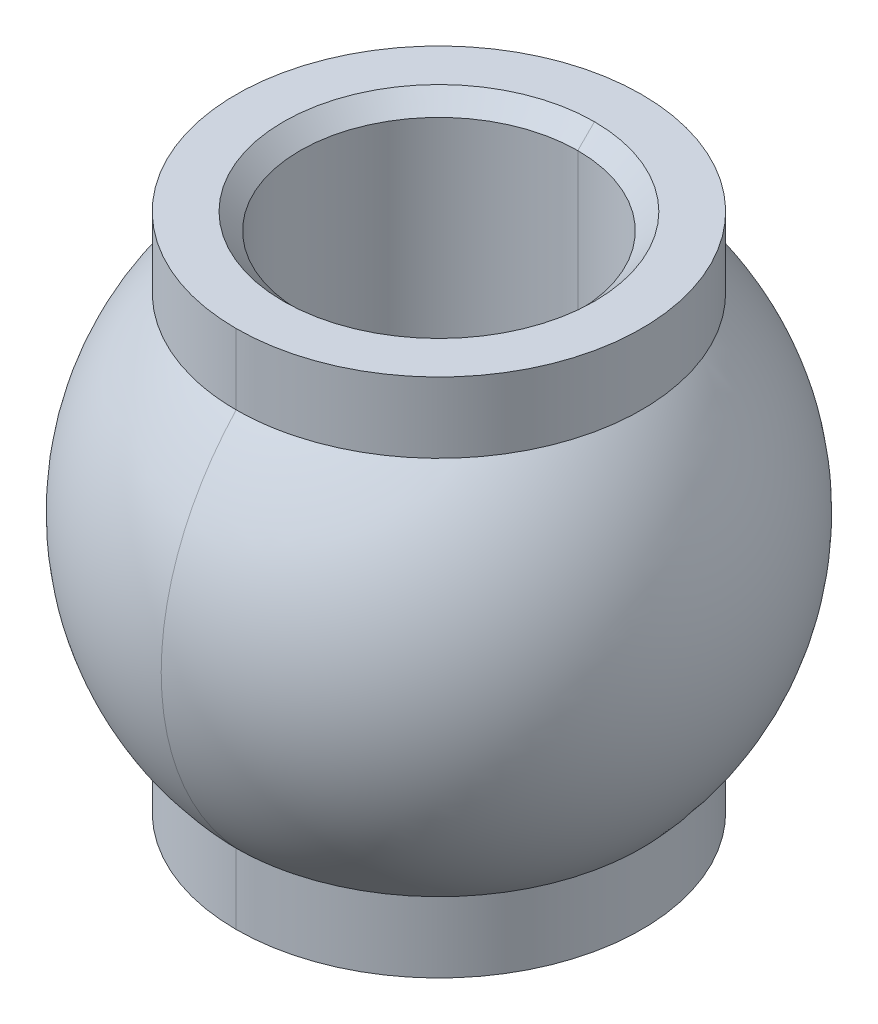
ISO-10303-21;
HEADER;
FILE_DESCRIPTION(('STEP AP214'),'2;1');
FILE_NAME('part.step','',(''),(''),'','','');
FILE_SCHEMA(('AUTOMOTIVE_DESIGN { 1 0 10303 214 1 1 1 1 }'));
ENDSEC;
DATA;
#1=APPLICATION_CONTEXT('core data for automotive mechanical design processes');
#2=APPLICATION_PROTOCOL_DEFINITION('international standard','automotive_design',2000,#1);
#3=PRODUCT_CONTEXT('',#1,'mechanical');
#4=PRODUCT('Part','Part','',(#3));
#5=PRODUCT_RELATED_PRODUCT_CATEGORY('part','',(#4));
#6=PRODUCT_DEFINITION_FORMATION('','',#4);
#7=PRODUCT_DEFINITION_CONTEXT('part definition',#1,'design');
#8=PRODUCT_DEFINITION('design','',#6,#7);
#9=PRODUCT_DEFINITION_SHAPE('','',#8);
#10=(LENGTH_UNIT() NAMED_UNIT(*) SI_UNIT(.MILLI.,.METRE.));
#11=(NAMED_UNIT(*) PLANE_ANGLE_UNIT() SI_UNIT($,.RADIAN.));
#12=(NAMED_UNIT(*) SI_UNIT($,.STERADIAN.) SOLID_ANGLE_UNIT());
#13=UNCERTAINTY_MEASURE_WITH_UNIT(LENGTH_MEASURE(1.E-05),#10,'distance_accuracy_value','');
#14=(GEOMETRIC_REPRESENTATION_CONTEXT(3) GLOBAL_UNCERTAINTY_ASSIGNED_CONTEXT((#13)) GLOBAL_UNIT_ASSIGNED_CONTEXT((#10,
#11,#12)) REPRESENTATION_CONTEXT('',''));
#15=CARTESIAN_POINT('',(0.,0.,0.));
#16=DIRECTION('',(0.,0.,1.));
#17=DIRECTION('',(1.,0.,0.));
#18=AXIS2_PLACEMENT_3D('',#15,#16,#17);
#19=CARTESIAN_POINT('',(0.,0.,0.));
#20=DIRECTION('',(0.,0.,1.));
#21=DIRECTION('',(1.,0.,0.));
#22=AXIS2_PLACEMENT_3D('',#19,#20,#21);
#23=SPHERICAL_SURFACE('',#22,12.7);
#24=CARTESIAN_POINT('',(0.,0.,0.));
#25=DIRECTION('',(1.,0.,0.));
#26=DIRECTION('',(0.,0.,1.));
#27=AXIS2_PLACEMENT_3D('',#24,#25,#26);
#28=CIRCLE('',#27,12.7);
#29=CARTESIAN_POINT('',(0.,-8.67977874141962,-9.271));
#30=VERTEX_POINT('',#29);
#31=CARTESIAN_POINT('',(0.,0.,-12.7));
#32=VERTEX_POINT('',#31);
#33=EDGE_CURVE('E107',#30,#32,#28,.T.);
#34=ORIENTED_EDGE('',*,*,#33,.T.);
#35=CARTESIAN_POINT('',(0.,0.,0.));
#36=DIRECTION('',(1.,0.,0.));
#37=DIRECTION('',(0.,0.,1.));
#38=AXIS2_PLACEMENT_3D('',#35,#36,#37);
#39=CIRCLE('',#38,12.7);
#40=CARTESIAN_POINT('',(0.,8.67977874141962,-9.271));
#41=VERTEX_POINT('',#40);
#42=EDGE_CURVE('E11',#32,#41,#39,.T.);
#43=ORIENTED_EDGE('',*,*,#42,.T.);
#44=CARTESIAN_POINT('',(0.,8.67977874141962,0.));
#45=DIRECTION('',(0.,-1.,0.));
#46=DIRECTION('',(0.,0.,-1.));
#47=AXIS2_PLACEMENT_3D('',#44,#45,#46);
#48=CIRCLE('',#47,9.271);
#49=CARTESIAN_POINT('',(0.,8.67977874141962,9.271));
#50=VERTEX_POINT('',#49);
#51=EDGE_CURVE('E104',#41,#50,#48,.T.);
#52=ORIENTED_EDGE('',*,*,#51,.T.);
#53=CARTESIAN_POINT('',(0.,0.,0.));
#54=DIRECTION('',(1.,0.,0.));
#55=DIRECTION('',(0.,0.,1.));
#56=AXIS2_PLACEMENT_3D('',#53,#54,#55);
#57=CIRCLE('',#56,12.7);
#58=CARTESIAN_POINT('',(0.,0.,12.7));
#59=VERTEX_POINT('',#58);
#60=EDGE_CURVE('E28',#50,#59,#57,.T.);
#61=ORIENTED_EDGE('',*,*,#60,.T.);
#62=CARTESIAN_POINT('',(0.,0.,0.));
#63=DIRECTION('',(1.,0.,0.));
#64=DIRECTION('',(0.,0.,1.));
#65=AXIS2_PLACEMENT_3D('',#62,#63,#64);
#66=CIRCLE('',#65,12.7);
#67=CARTESIAN_POINT('',(0.,-8.67977874141962,9.271));
#68=VERTEX_POINT('',#67);
#69=EDGE_CURVE('E171',#59,#68,#66,.T.);
#70=ORIENTED_EDGE('',*,*,#69,.T.);
#71=CARTESIAN_POINT('',(0.,-8.67977874141962,0.));
#72=DIRECTION('',(0.,1.,0.));
#73=DIRECTION('',(0.,0.,-1.));
#74=AXIS2_PLACEMENT_3D('',#71,#72,#73);
#75=CIRCLE('',#74,9.271);
#76=EDGE_CURVE('E119',#68,#30,#75,.T.);
#77=ORIENTED_EDGE('',*,*,#76,.T.);
#78=EDGE_LOOP('',(#34,#43,#52,#61,#70,#77));
#79=FACE_BOUND('',#78,.T.);
#80=ADVANCED_FACE('F17',(#79),#23,.T.);
#81=CARTESIAN_POINT('',(0.,0.,0.));
#82=DIRECTION('',(0.,0.,1.));
#83=DIRECTION('',(1.,0.,0.));
#84=AXIS2_PLACEMENT_3D('',#81,#82,#83);
#85=SPHERICAL_SURFACE('',#84,12.7);
#86=ORIENTED_EDGE('',*,*,#33,.F.);
#87=CARTESIAN_POINT('',(0.,-8.67977874141962,0.));
#88=DIRECTION('',(0.,1.,0.));
#89=DIRECTION('',(0.,0.,-1.));
#90=AXIS2_PLACEMENT_3D('',#87,#88,#89);
#91=CIRCLE('',#90,9.271);
#92=EDGE_CURVE('E156',#30,#68,#91,.T.);
#93=ORIENTED_EDGE('',*,*,#92,.T.);
#94=ORIENTED_EDGE('',*,*,#69,.F.);
#95=ORIENTED_EDGE('',*,*,#60,.F.);
#96=CARTESIAN_POINT('',(0.,8.67977874141962,0.));
#97=DIRECTION('',(0.,-1.,0.));
#98=DIRECTION('',(0.,0.,-1.));
#99=AXIS2_PLACEMENT_3D('',#96,#97,#98);
#100=CIRCLE('',#99,9.271);
#101=EDGE_CURVE('E121',#50,#41,#100,.T.);
#102=ORIENTED_EDGE('',*,*,#101,.T.);
#103=ORIENTED_EDGE('',*,*,#42,.F.);
#104=EDGE_LOOP('',(#86,#93,#94,#95,#102,#103));
#105=FACE_BOUND('',#104,.T.);
#106=ADVANCED_FACE('F122',(#105),#85,.T.);
#107=CARTESIAN_POINT('',(0.,0.,0.));
#108=DIRECTION('',(0.,1.,0.));
#109=DIRECTION('',(0.,0.,-1.));
#110=AXIS2_PLACEMENT_3D('',#107,#108,#109);
#111=CYLINDRICAL_SURFACE('',#110,9.271);
#112=DIRECTION('',(0.,1.,0.));
#113=VECTOR('',#112,1.);
#114=CARTESIAN_POINT('',(0.,0.,-9.271));
#115=LINE('',#114,#113);
#116=CARTESIAN_POINT('',(0.,11.8999,-9.271));
#117=VERTEX_POINT('',#116);
#118=EDGE_CURVE('E114',#41,#117,#115,.T.);
#119=ORIENTED_EDGE('',*,*,#118,.T.);
#120=CARTESIAN_POINT('',(0.,11.8999,0.));
#121=DIRECTION('',(0.,1.,0.));
#122=DIRECTION('',(0.,0.,-1.));
#123=AXIS2_PLACEMENT_3D('',#120,#121,#122);
#124=CIRCLE('',#123,9.271);
#125=CARTESIAN_POINT('',(0.,11.8999,9.271));
#126=VERTEX_POINT('',#125);
#127=EDGE_CURVE('E131',#126,#117,#124,.T.);
#128=ORIENTED_EDGE('',*,*,#127,.F.);
#129=DIRECTION('',(0.,-1.,0.));
#130=VECTOR('',#129,1.);
#131=CARTESIAN_POINT('',(0.,0.,9.271));
#132=LINE('',#131,#130);
#133=EDGE_CURVE('E116',#126,#50,#132,.T.);
#134=ORIENTED_EDGE('',*,*,#133,.T.);
#135=ORIENTED_EDGE('',*,*,#51,.F.);
#136=EDGE_LOOP('',(#119,#128,#134,#135));
#137=FACE_BOUND('',#136,.T.);
#138=ADVANCED_FACE('F111',(#137),#111,.T.);
#139=CARTESIAN_POINT('',(0.,0.,0.));
#140=DIRECTION('',(0.,1.,0.));
#141=DIRECTION('',(0.,0.,-1.));
#142=AXIS2_PLACEMENT_3D('',#139,#140,#141);
#143=CYLINDRICAL_SURFACE('',#142,9.271);
#144=DIRECTION('',(0.,1.,0.));
#145=VECTOR('',#144,1.);
#146=CARTESIAN_POINT('',(0.,0.,-9.271));
#147=LINE('',#146,#145);
#148=CARTESIAN_POINT('',(0.,-11.8999,-9.271));
#149=VERTEX_POINT('',#148);
#150=EDGE_CURVE('E145',#149,#30,#147,.T.);
#151=ORIENTED_EDGE('',*,*,#150,.T.);
#152=ORIENTED_EDGE('',*,*,#76,.F.);
#153=DIRECTION('',(0.,-1.,0.));
#154=VECTOR('',#153,1.);
#155=CARTESIAN_POINT('',(0.,0.,9.271));
#156=LINE('',#155,#154);
#157=CARTESIAN_POINT('',(0.,-11.8999,9.271));
#158=VERTEX_POINT('',#157);
#159=EDGE_CURVE('E148',#68,#158,#156,.T.);
#160=ORIENTED_EDGE('',*,*,#159,.T.);
#161=CARTESIAN_POINT('',(0.,-11.8999,0.));
#162=DIRECTION('',(0.,-1.,0.));
#163=DIRECTION('',(0.,0.,-1.));
#164=AXIS2_PLACEMENT_3D('',#161,#162,#163);
#165=CIRCLE('',#164,9.271);
#166=EDGE_CURVE('E144',#149,#158,#165,.T.);
#167=ORIENTED_EDGE('',*,*,#166,.F.);
#168=EDGE_LOOP('',(#151,#152,#160,#167));
#169=FACE_BOUND('',#168,.T.);
#170=ADVANCED_FACE('F437',(#169),#143,.T.);
#171=CARTESIAN_POINT('',(0.,0.,0.));
#172=DIRECTION('',(0.,1.,0.));
#173=DIRECTION('',(0.,0.,-1.));
#174=AXIS2_PLACEMENT_3D('',#171,#172,#173);
#175=CYLINDRICAL_SURFACE('',#174,9.271);
#176=ORIENTED_EDGE('',*,*,#150,.F.);
#177=CARTESIAN_POINT('',(0.,-11.8999,0.));
#178=DIRECTION('',(0.,-1.,0.));
#179=DIRECTION('',(0.,0.,-1.));
#180=AXIS2_PLACEMENT_3D('',#177,#178,#179);
#181=CIRCLE('',#180,9.271);
#182=EDGE_CURVE('E142',#158,#149,#181,.T.);
#183=ORIENTED_EDGE('',*,*,#182,.F.);
#184=ORIENTED_EDGE('',*,*,#159,.F.);
#185=ORIENTED_EDGE('',*,*,#92,.F.);
#186=EDGE_LOOP('',(#176,#183,#184,#185));
#187=FACE_BOUND('',#186,.T.);
#188=ADVANCED_FACE('F426',(#187),#175,.T.);
#189=CARTESIAN_POINT('',(0.,0.,0.));
#190=DIRECTION('',(0.,1.,0.));
#191=DIRECTION('',(0.,0.,-1.));
#192=AXIS2_PLACEMENT_3D('',#189,#190,#191);
#193=CYLINDRICAL_SURFACE('',#192,9.271);
#194=ORIENTED_EDGE('',*,*,#118,.F.);
#195=ORIENTED_EDGE('',*,*,#101,.F.);
#196=ORIENTED_EDGE('',*,*,#133,.F.);
#197=CARTESIAN_POINT('',(0.,11.8999,0.));
#198=DIRECTION('',(0.,1.,0.));
#199=DIRECTION('',(0.,0.,-1.));
#200=AXIS2_PLACEMENT_3D('',#197,#198,#199);
#201=CIRCLE('',#200,9.271);
#202=EDGE_CURVE('E129',#117,#126,#201,.T.);
#203=ORIENTED_EDGE('',*,*,#202,.F.);
#204=EDGE_LOOP('',(#194,#195,#196,#203));
#205=FACE_BOUND('',#204,.T.);
#206=ADVANCED_FACE('F127',(#205),#193,.T.);
#207=CARTESIAN_POINT('',(0.,11.8999,0.));
#208=DIRECTION('',(0.,1.,0.));
#209=DIRECTION('',(1.,0.,0.));
#210=AXIS2_PLACEMENT_3D('',#207,#208,#209);
#211=PLANE('',#210);
#212=ORIENTED_EDGE('',*,*,#202,.T.);
#213=ORIENTED_EDGE('',*,*,#127,.T.);
#214=EDGE_LOOP('',(#212,#213));
#215=FACE_BOUND('',#214,.T.);
#216=CARTESIAN_POINT('',(0.,11.8999,0.));
#217=DIRECTION('',(0.,-1.,0.));
#218=DIRECTION('',(0.,0.,-1.));
#219=AXIS2_PLACEMENT_3D('',#216,#217,#218);
#220=CIRCLE('',#219,7.112);
#221=CARTESIAN_POINT('',(0.,11.8999,-7.112));
#222=VERTEX_POINT('',#221);
#223=CARTESIAN_POINT('',(0.,11.8999,7.112));
#224=VERTEX_POINT('',#223);
#225=EDGE_CURVE('E165',#222,#224,#220,.T.);
#226=ORIENTED_EDGE('',*,*,#225,.T.);
#227=CARTESIAN_POINT('',(0.,11.8999,0.));
#228=DIRECTION('',(0.,-1.,0.));
#229=DIRECTION('',(0.,0.,-1.));
#230=AXIS2_PLACEMENT_3D('',#227,#228,#229);
#231=CIRCLE('',#230,7.112);
#232=EDGE_CURVE('E188',#224,#222,#231,.T.);
#233=ORIENTED_EDGE('',*,*,#232,.T.);
#234=EDGE_LOOP('',(#226,#233));
#235=FACE_BOUND('',#234,.T.);
#236=ADVANCED_FACE('F409',(#215,#235),#211,.T.);
#237=CARTESIAN_POINT('',(0.,-11.8999,0.));
#238=DIRECTION('',(0.,-1.,0.));
#239=DIRECTION('',(0.,0.,-1.));
#240=AXIS2_PLACEMENT_3D('',#237,#238,#239);
#241=PLANE('',#240);
#242=ORIENTED_EDGE('',*,*,#166,.T.);
#243=ORIENTED_EDGE('',*,*,#182,.T.);
#244=EDGE_LOOP('',(#242,#243));
#245=FACE_BOUND('',#244,.T.);
#246=CARTESIAN_POINT('',(0.,-11.8999,0.));
#247=DIRECTION('',(0.,1.,0.));
#248=DIRECTION('',(0.,0.,-1.));
#249=AXIS2_PLACEMENT_3D('',#246,#247,#248);
#250=CIRCLE('',#249,7.112);
#251=CARTESIAN_POINT('',(0.,-11.8999,-7.112));
#252=VERTEX_POINT('',#251);
#253=CARTESIAN_POINT('',(0.,-11.8999,7.112));
#254=VERTEX_POINT('',#253);
#255=EDGE_CURVE('E169',#252,#254,#250,.T.);
#256=ORIENTED_EDGE('',*,*,#255,.T.);
#257=CARTESIAN_POINT('',(0.,-11.8999,0.));
#258=DIRECTION('',(0.,1.,0.));
#259=DIRECTION('',(0.,0.,-1.));
#260=AXIS2_PLACEMENT_3D('',#257,#258,#259);
#261=CIRCLE('',#260,7.112);
#262=EDGE_CURVE('E170',#254,#252,#261,.T.);
#263=ORIENTED_EDGE('',*,*,#262,.T.);
#264=EDGE_LOOP('',(#256,#263));
#265=FACE_BOUND('',#264,.T.);
#266=ADVANCED_FACE('F401',(#245,#265),#241,.T.);
#267=CARTESIAN_POINT('',(0.,11.5189,0.));
#268=DIRECTION('',(0.,1.,0.));
#269=DIRECTION('',(0.,0.,-1.));
#270=AXIS2_PLACEMENT_3D('',#267,#268,#269);
#271=CONICAL_SURFACE('',#270,6.731,0.785398163397449);
#272=DIRECTION('',(0.,0.707106781186547,-0.707106781186548));
#273=VECTOR('',#272,1.);
#274=CARTESIAN_POINT('',(0.,11.5189,-6.731));
#275=LINE('',#274,#273);
#276=CARTESIAN_POINT('',(0.,11.1379,-6.35));
#277=VERTEX_POINT('',#276);
#278=EDGE_CURVE('E179',#277,#222,#275,.T.);
#279=ORIENTED_EDGE('',*,*,#278,.F.);
#280=CARTESIAN_POINT('',(0.,11.1379,0.));
#281=DIRECTION('',(0.,1.,0.));
#282=DIRECTION('',(0.,0.,-1.));
#283=AXIS2_PLACEMENT_3D('',#280,#281,#282);
#284=CIRCLE('',#283,6.35);
#285=CARTESIAN_POINT('',(0.,11.1379,6.35));
#286=VERTEX_POINT('',#285);
#287=EDGE_CURVE('E209',#286,#277,#284,.T.);
#288=ORIENTED_EDGE('',*,*,#287,.F.);
#289=DIRECTION('',(0.,-0.707106781186547,-0.707106781186548));
#290=VECTOR('',#289,1.);
#291=CARTESIAN_POINT('',(0.,11.5189,6.731));
#292=LINE('',#291,#290);
#293=EDGE_CURVE('E21',#224,#286,#292,.T.);
#294=ORIENTED_EDGE('',*,*,#293,.F.);
#295=ORIENTED_EDGE('',*,*,#225,.F.);
#296=EDGE_LOOP('',(#279,#288,#294,#295));
#297=FACE_BOUND('',#296,.T.);
#298=ADVANCED_FACE('F239',(#297),#271,.F.);
#299=CARTESIAN_POINT('',(0.,11.5189,0.));
#300=DIRECTION('',(0.,1.,0.));
#301=DIRECTION('',(0.,0.,-1.));
#302=AXIS2_PLACEMENT_3D('',#299,#300,#301);
#303=CONICAL_SURFACE('',#302,6.731,0.785398163397449);
#304=ORIENTED_EDGE('',*,*,#278,.T.);
#305=ORIENTED_EDGE('',*,*,#232,.F.);
#306=ORIENTED_EDGE('',*,*,#293,.T.);
#307=CARTESIAN_POINT('',(0.,11.1379,0.));
#308=DIRECTION('',(0.,1.,0.));
#309=DIRECTION('',(0.,0.,-1.));
#310=AXIS2_PLACEMENT_3D('',#307,#308,#309);
#311=CIRCLE('',#310,6.35);
#312=EDGE_CURVE('E196',#277,#286,#311,.T.);
#313=ORIENTED_EDGE('',*,*,#312,.F.);
#314=EDGE_LOOP('',(#304,#305,#306,#313));
#315=FACE_BOUND('',#314,.T.);
#316=ADVANCED_FACE('F234',(#315),#303,.F.);
#317=CARTESIAN_POINT('',(0.,-11.5189,0.));
#318=DIRECTION('',(0.,-1.,0.));
#319=DIRECTION('',(0.,0.,-1.));
#320=AXIS2_PLACEMENT_3D('',#317,#318,#319);
#321=CONICAL_SURFACE('',#320,6.731,0.785398163397449);
#322=DIRECTION('',(0.,-0.707106781186547,-0.707106781186548));
#323=VECTOR('',#322,1.);
#324=CARTESIAN_POINT('',(0.,-11.5189,-6.731));
#325=LINE('',#324,#323);
#326=CARTESIAN_POINT('',(0.,-11.1379,-6.35));
#327=VERTEX_POINT('',#326);
#328=EDGE_CURVE('E177',#327,#252,#325,.T.);
#329=ORIENTED_EDGE('',*,*,#328,.F.);
#330=CARTESIAN_POINT('',(0.,-11.1379,0.));
#331=DIRECTION('',(0.,-1.,0.));
#332=DIRECTION('',(0.,0.,-1.));
#333=AXIS2_PLACEMENT_3D('',#330,#331,#332);
#334=CIRCLE('',#333,6.35);
#335=CARTESIAN_POINT('',(0.,-11.1379,6.35));
#336=VERTEX_POINT('',#335);
#337=EDGE_CURVE('E197',#336,#327,#334,.T.);
#338=ORIENTED_EDGE('',*,*,#337,.F.);
#339=DIRECTION('',(0.,0.707106781186547,-0.707106781186548));
#340=VECTOR('',#339,1.);
#341=CARTESIAN_POINT('',(0.,-11.5189,6.731));
#342=LINE('',#341,#340);
#343=EDGE_CURVE('E166',#254,#336,#342,.T.);
#344=ORIENTED_EDGE('',*,*,#343,.F.);
#345=ORIENTED_EDGE('',*,*,#255,.F.);
#346=EDGE_LOOP('',(#329,#338,#344,#345));
#347=FACE_BOUND('',#346,.T.);
#348=ADVANCED_FACE('F248',(#347),#321,.F.);
#349=CARTESIAN_POINT('',(0.,-11.5189,0.));
#350=DIRECTION('',(0.,-1.,0.));
#351=DIRECTION('',(0.,0.,-1.));
#352=AXIS2_PLACEMENT_3D('',#349,#350,#351);
#353=CONICAL_SURFACE('',#352,6.731,0.785398163397449);
#354=ORIENTED_EDGE('',*,*,#328,.T.);
#355=ORIENTED_EDGE('',*,*,#262,.F.);
#356=ORIENTED_EDGE('',*,*,#343,.T.);
#357=CARTESIAN_POINT('',(0.,-11.1379,0.));
#358=DIRECTION('',(0.,-1.,0.));
#359=DIRECTION('',(0.,0.,-1.));
#360=AXIS2_PLACEMENT_3D('',#357,#358,#359);
#361=CIRCLE('',#360,6.35);
#362=EDGE_CURVE('E201',#327,#336,#361,.T.);
#363=ORIENTED_EDGE('',*,*,#362,.F.);
#364=EDGE_LOOP('',(#354,#355,#356,#363));
#365=FACE_BOUND('',#364,.T.);
#366=ADVANCED_FACE('F19',(#365),#353,.F.);
#367=CARTESIAN_POINT('',(0.,0.,0.));
#368=DIRECTION('',(0.,1.,0.));
#369=DIRECTION('',(0.,0.,-1.));
#370=AXIS2_PLACEMENT_3D('',#367,#368,#369);
#371=CYLINDRICAL_SURFACE('',#370,6.35);
#372=DIRECTION('',(0.,-1.,0.));
#373=VECTOR('',#372,1.);
#374=CARTESIAN_POINT('',(0.,0.,-6.35));
#375=LINE('',#374,#373);
#376=EDGE_CURVE('E192',#277,#327,#375,.T.);
#377=ORIENTED_EDGE('',*,*,#376,.T.);
#378=ORIENTED_EDGE('',*,*,#362,.T.);
#379=DIRECTION('',(0.,1.,0.));
#380=VECTOR('',#379,1.);
#381=CARTESIAN_POINT('',(0.,0.,6.35));
#382=LINE('',#381,#380);
#383=EDGE_CURVE('E202',#336,#286,#382,.T.);
#384=ORIENTED_EDGE('',*,*,#383,.T.);
#385=ORIENTED_EDGE('',*,*,#287,.T.);
#386=EDGE_LOOP('',(#377,#378,#384,#385));
#387=FACE_BOUND('',#386,.T.);
#388=ADVANCED_FACE('F241',(#387),#371,.F.);
#389=CARTESIAN_POINT('',(0.,0.,0.));
#390=DIRECTION('',(0.,1.,0.));
#391=DIRECTION('',(0.,0.,-1.));
#392=AXIS2_PLACEMENT_3D('',#389,#390,#391);
#393=CYLINDRICAL_SURFACE('',#392,6.35);
#394=ORIENTED_EDGE('',*,*,#376,.F.);
#395=ORIENTED_EDGE('',*,*,#312,.T.);
#396=ORIENTED_EDGE('',*,*,#383,.F.);
#397=ORIENTED_EDGE('',*,*,#337,.T.);
#398=EDGE_LOOP('',(#394,#395,#396,#397));
#399=FACE_BOUND('',#398,.T.);
#400=ADVANCED_FACE('F232',(#399),#393,.F.);
#401=CLOSED_SHELL('',(#80,#106,#138,#170,#188,#206,#236,#266,#298,#316,#348,#366,#388,#400));
#402=MANIFOLD_SOLID_BREP('B1',#401);
#403=ADVANCED_BREP_SHAPE_REPRESENTATION('',(#18,#402),#14);
#404=SHAPE_DEFINITION_REPRESENTATION(#9,#403);
ENDSEC;
END-ISO-10303-21;
